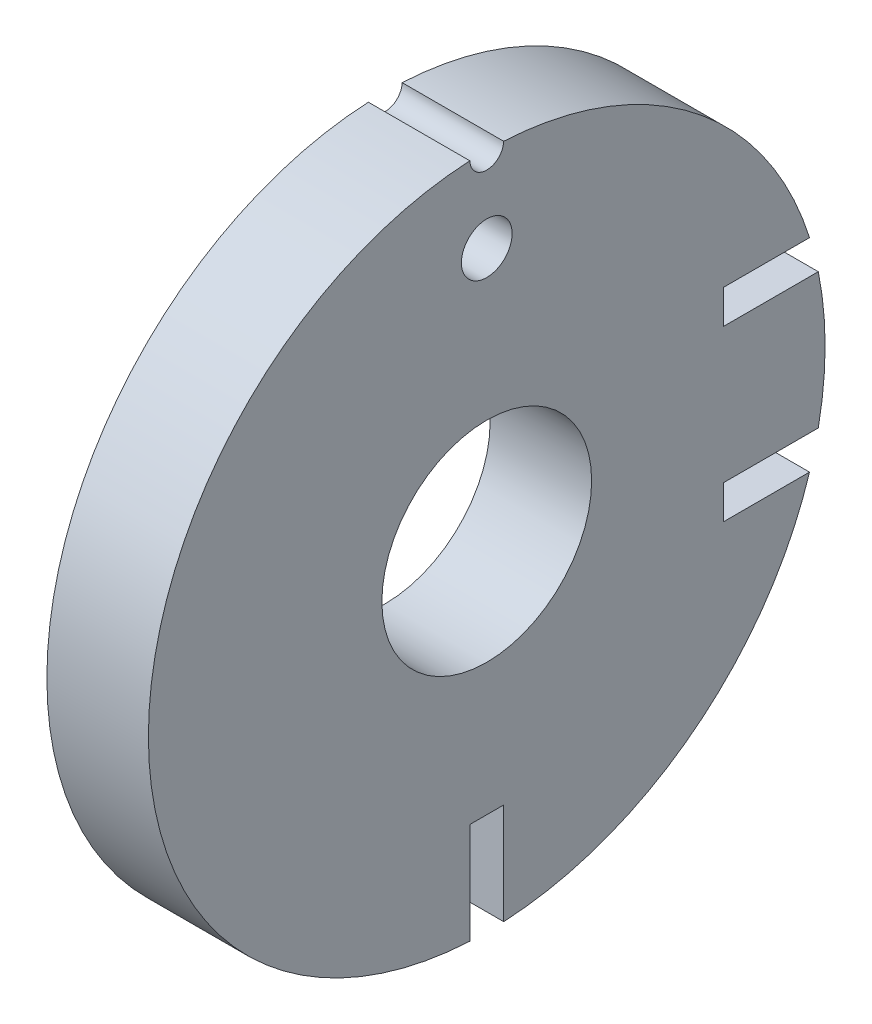
ISO-10303-21;
HEADER;
FILE_DESCRIPTION(('STEP AP214'),'2;1');
FILE_NAME('part.step','',(''),(''),'','','');
FILE_SCHEMA(('AUTOMOTIVE_DESIGN { 1 0 10303 214 1 1 1 1 }'));
ENDSEC;
DATA;
#1=APPLICATION_CONTEXT('core data for automotive mechanical design processes');
#2=APPLICATION_PROTOCOL_DEFINITION('international standard','automotive_design',2000,#1);
#3=PRODUCT_CONTEXT('',#1,'mechanical');
#4=PRODUCT('Part','Part','',(#3));
#5=PRODUCT_RELATED_PRODUCT_CATEGORY('part','',(#4));
#6=PRODUCT_DEFINITION_FORMATION('','',#4);
#7=PRODUCT_DEFINITION_CONTEXT('part definition',#1,'design');
#8=PRODUCT_DEFINITION('design','',#6,#7);
#9=PRODUCT_DEFINITION_SHAPE('','',#8);
#10=(LENGTH_UNIT() NAMED_UNIT(*) SI_UNIT(.MILLI.,.METRE.));
#11=(NAMED_UNIT(*) PLANE_ANGLE_UNIT() SI_UNIT($,.RADIAN.));
#12=(NAMED_UNIT(*) SI_UNIT($,.STERADIAN.) SOLID_ANGLE_UNIT());
#13=UNCERTAINTY_MEASURE_WITH_UNIT(LENGTH_MEASURE(1.E-05),#10,'distance_accuracy_value','');
#14=(GEOMETRIC_REPRESENTATION_CONTEXT(3) GLOBAL_UNCERTAINTY_ASSIGNED_CONTEXT((#13)) GLOBAL_UNIT_ASSIGNED_CONTEXT((#10,
#11,#12)) REPRESENTATION_CONTEXT('',''));
#15=CARTESIAN_POINT('',(0.,0.,0.));
#16=DIRECTION('',(0.,0.,1.));
#17=DIRECTION('',(1.,0.,0.));
#18=AXIS2_PLACEMENT_3D('',#15,#16,#17);
#19=CARTESIAN_POINT('',(3.,0.,0.));
#20=DIRECTION('',(-1.,0.,0.));
#21=DIRECTION('',(0.,0.,1.));
#22=AXIS2_PLACEMENT_3D('',#19,#20,#21);
#23=CYLINDRICAL_SURFACE('',#22,10.);
#24=CARTESIAN_POINT('',(0.,0.,0.));
#25=DIRECTION('',(1.,0.,0.));
#26=DIRECTION('',(0.,0.,-1.));
#27=AXIS2_PLACEMENT_3D('',#24,#25,#26);
#28=CIRCLE('',#27,10.);
#29=CARTESIAN_POINT('',(0.,9.9875,0.499843725578305));
#30=VERTEX_POINT('',#29);
#31=CARTESIAN_POINT('',(0.,-9.98749217771909,0.499999999999999));
#32=VERTEX_POINT('',#31);
#33=EDGE_CURVE('E262',#30,#32,#28,.T.);
#34=ORIENTED_EDGE('',*,*,#33,.T.);
#35=DIRECTION('',(-1.,0.,0.));
#36=VECTOR('',#35,1.);
#37=CARTESIAN_POINT('',(3.,-9.98749217771909,0.499999999999999));
#38=LINE('',#37,#36);
#39=CARTESIAN_POINT('',(3.,-9.98749217771909,0.499999999999999));
#40=VERTEX_POINT('',#39);
#41=EDGE_CURVE('E11',#32,#40,#38,.F.);
#42=ORIENTED_EDGE('',*,*,#41,.T.);
#43=CARTESIAN_POINT('',(3.,0.,0.));
#44=DIRECTION('',(1.,0.,0.));
#45=DIRECTION('',(0.,0.,-1.));
#46=AXIS2_PLACEMENT_3D('',#43,#44,#45);
#47=CIRCLE('',#46,10.);
#48=CARTESIAN_POINT('',(3.,9.9875,0.499843725578305));
#49=VERTEX_POINT('',#48);
#50=EDGE_CURVE('E276',#49,#40,#47,.T.);
#51=ORIENTED_EDGE('',*,*,#50,.F.);
#52=DIRECTION('',(1.,0.,0.));
#53=VECTOR('',#52,1.);
#54=CARTESIAN_POINT('',(1.5,9.9875,0.499843725578305));
#55=LINE('',#54,#53);
#56=EDGE_CURVE('E238',#49,#30,#55,.F.);
#57=ORIENTED_EDGE('',*,*,#56,.T.);
#58=EDGE_LOOP('',(#34,#42,#51,#57));
#59=FACE_BOUND('',#58,.T.);
#60=ADVANCED_FACE('F39',(#59),#23,.T.);
#61=CARTESIAN_POINT('',(3.,-2.,-9.79795897113271));
#62=VERTEX_POINT('',#61);
#63=CARTESIAN_POINT('',(3.,2.,-9.79795897113271));
#64=VERTEX_POINT('',#63);
#65=EDGE_CURVE('E230',#62,#64,#47,.T.);
#66=ORIENTED_EDGE('',*,*,#65,.F.);
#67=DIRECTION('',(-1.,0.,0.));
#68=VECTOR('',#67,1.);
#69=CARTESIAN_POINT('',(3.,-2.,-9.79795897113271));
#70=LINE('',#69,#68);
#71=CARTESIAN_POINT('',(0.,-2.,-9.79795897113271));
#72=VERTEX_POINT('',#71);
#73=EDGE_CURVE('E250',#62,#72,#70,.T.);
#74=ORIENTED_EDGE('',*,*,#73,.T.);
#75=CARTESIAN_POINT('',(0.,2.,-9.79795897113271));
#76=VERTEX_POINT('',#75);
#77=EDGE_CURVE('E227',#72,#76,#28,.T.);
#78=ORIENTED_EDGE('',*,*,#77,.T.);
#79=DIRECTION('',(-1.,0.,0.));
#80=VECTOR('',#79,1.);
#81=CARTESIAN_POINT('',(3.,2.,-9.79795897113271));
#82=LINE('',#81,#80);
#83=EDGE_CURVE('E243',#76,#64,#82,.F.);
#84=ORIENTED_EDGE('',*,*,#83,.T.);
#85=EDGE_LOOP('',(#66,#74,#78,#84));
#86=FACE_BOUND('',#85,.T.);
#87=ADVANCED_FACE('F295',(#86),#23,.T.);
#88=CARTESIAN_POINT('',(3.,3.,-9.53939201416945));
#89=VERTEX_POINT('',#88);
#90=CARTESIAN_POINT('',(3.,9.9875,-0.499843725578305));
#91=VERTEX_POINT('',#90);
#92=EDGE_CURVE('E234',#89,#91,#47,.T.);
#93=ORIENTED_EDGE('',*,*,#92,.F.);
#94=DIRECTION('',(-1.,0.,0.));
#95=VECTOR('',#94,1.);
#96=CARTESIAN_POINT('',(3.,3.,-9.53939201416946));
#97=LINE('',#96,#95);
#98=CARTESIAN_POINT('',(0.,3.,-9.53939201416945));
#99=VERTEX_POINT('',#98);
#100=EDGE_CURVE('E145',#89,#99,#97,.T.);
#101=ORIENTED_EDGE('',*,*,#100,.T.);
#102=CARTESIAN_POINT('',(0.,9.9875,-0.499843725578305));
#103=VERTEX_POINT('',#102);
#104=EDGE_CURVE('E233',#99,#103,#28,.T.);
#105=ORIENTED_EDGE('',*,*,#104,.T.);
#106=DIRECTION('',(1.,0.,0.));
#107=VECTOR('',#106,1.);
#108=CARTESIAN_POINT('',(1.5,9.9875,-0.499843725578305));
#109=LINE('',#108,#107);
#110=EDGE_CURVE('E240',#103,#91,#109,.T.);
#111=ORIENTED_EDGE('',*,*,#110,.T.);
#112=EDGE_LOOP('',(#93,#101,#105,#111));
#113=FACE_BOUND('',#112,.T.);
#114=ADVANCED_FACE('F269',(#113),#23,.T.);
#115=CARTESIAN_POINT('',(3.,0.,0.));
#116=DIRECTION('',(1.,0.,0.));
#117=DIRECTION('',(0.,0.,-1.));
#118=AXIS2_PLACEMENT_3D('',#115,#116,#117);
#119=PLANE('',#118);
#120=DIRECTION('',(0.,-1.,0.));
#121=VECTOR('',#120,1.);
#122=CARTESIAN_POINT('',(3.,-7.,0.499999999999999));
#123=LINE('',#122,#121);
#124=CARTESIAN_POINT('',(3.,-7.,0.499999999999999));
#125=VERTEX_POINT('',#124);
#126=EDGE_CURVE('E184',#125,#40,#123,.T.);
#127=ORIENTED_EDGE('',*,*,#126,.F.);
#128=DIRECTION('',(0.,0.,1.));
#129=VECTOR('',#128,1.);
#130=CARTESIAN_POINT('',(3.,-7.,0.499999999999999));
#131=LINE('',#130,#129);
#132=CARTESIAN_POINT('',(3.,-7.,-0.500000000000001));
#133=VERTEX_POINT('',#132);
#134=EDGE_CURVE('E205',#133,#125,#131,.T.);
#135=ORIENTED_EDGE('',*,*,#134,.F.);
#136=DIRECTION('',(0.,1.,0.));
#137=VECTOR('',#136,1.);
#138=CARTESIAN_POINT('',(3.,-7.,-0.500000000000001));
#139=LINE('',#138,#137);
#140=CARTESIAN_POINT('',(3.,-9.98749217771909,-0.500000000000001));
#141=VERTEX_POINT('',#140);
#142=EDGE_CURVE('E208',#141,#133,#139,.T.);
#143=ORIENTED_EDGE('',*,*,#142,.F.);
#144=CARTESIAN_POINT('',(3.,-3.,-9.53939201416946));
#145=VERTEX_POINT('',#144);
#146=EDGE_CURVE('E232',#141,#145,#47,.T.);
#147=ORIENTED_EDGE('',*,*,#146,.T.);
#148=DIRECTION('',(0.,0.,-1.));
#149=VECTOR('',#148,1.);
#150=CARTESIAN_POINT('',(3.,-3.,-7.));
#151=LINE('',#150,#149);
#152=CARTESIAN_POINT('',(3.,-3.,-7.));
#153=VERTEX_POINT('',#152);
#154=EDGE_CURVE('E187',#153,#145,#151,.T.);
#155=ORIENTED_EDGE('',*,*,#154,.F.);
#156=DIRECTION('',(0.,-1.,0.));
#157=VECTOR('',#156,1.);
#158=CARTESIAN_POINT('',(3.,-2.,-7.));
#159=LINE('',#158,#157);
#160=CARTESIAN_POINT('',(3.,-2.,-7.));
#161=VERTEX_POINT('',#160);
#162=EDGE_CURVE('E161',#161,#153,#159,.T.);
#163=ORIENTED_EDGE('',*,*,#162,.F.);
#164=DIRECTION('',(0.,0.,1.));
#165=VECTOR('',#164,1.);
#166=CARTESIAN_POINT('',(3.,-2.,-7.));
#167=LINE('',#166,#165);
#168=EDGE_CURVE('E185',#62,#161,#167,.T.);
#169=ORIENTED_EDGE('',*,*,#168,.F.);
#170=ORIENTED_EDGE('',*,*,#65,.T.);
#171=DIRECTION('',(0.,0.,-1.));
#172=VECTOR('',#171,1.);
#173=CARTESIAN_POINT('',(3.,2.,-7.));
#174=LINE('',#173,#172);
#175=CARTESIAN_POINT('',(3.,2.,-7.));
#176=VERTEX_POINT('',#175);
#177=EDGE_CURVE('E150',#176,#64,#174,.T.);
#178=ORIENTED_EDGE('',*,*,#177,.F.);
#179=DIRECTION('',(0.,-1.,0.));
#180=VECTOR('',#179,1.);
#181=CARTESIAN_POINT('',(3.,3.,-7.));
#182=LINE('',#181,#180);
#183=CARTESIAN_POINT('',(3.,3.,-7.));
#184=VERTEX_POINT('',#183);
#185=EDGE_CURVE('E156',#184,#176,#182,.T.);
#186=ORIENTED_EDGE('',*,*,#185,.F.);
#187=DIRECTION('',(0.,0.,1.));
#188=VECTOR('',#187,1.);
#189=CARTESIAN_POINT('',(3.,3.,-7.));
#190=LINE('',#189,#188);
#191=EDGE_CURVE('E139',#89,#184,#190,.T.);
#192=ORIENTED_EDGE('',*,*,#191,.F.);
#193=ORIENTED_EDGE('',*,*,#92,.T.);
#194=CARTESIAN_POINT('',(3.,10.,0.));
#195=DIRECTION('',(1.,0.,0.));
#196=DIRECTION('',(0.,0.,-1.));
#197=AXIS2_PLACEMENT_3D('',#194,#195,#196);
#198=CIRCLE('',#197,0.5);
#199=EDGE_CURVE('E168',#49,#91,#198,.T.);
#200=ORIENTED_EDGE('',*,*,#199,.F.);
#201=ORIENTED_EDGE('',*,*,#50,.T.);
#202=EDGE_LOOP('',(#127,#135,#143,#147,#155,#163,#169,#170,#178,#186,#192,#193,#200,#201));
#203=FACE_BOUND('',#202,.T.);
#204=CARTESIAN_POINT('',(3.,7.5,0.));
#205=DIRECTION('',(1.,0.,0.));
#206=DIRECTION('',(0.,0.,-1.));
#207=AXIS2_PLACEMENT_3D('',#204,#205,#206);
#208=CIRCLE('',#207,0.75);
#209=CARTESIAN_POINT('',(3.,7.5,-0.75));
#210=VERTEX_POINT('',#209);
#211=EDGE_CURVE('E221',#210,#210,#208,.T.);
#212=ORIENTED_EDGE('',*,*,#211,.F.);
#213=EDGE_LOOP('',(#212));
#214=FACE_BOUND('',#213,.T.);
#215=CARTESIAN_POINT('',(3.,0.,0.));
#216=DIRECTION('',(1.,0.,0.));
#217=DIRECTION('',(0.,0.,-1.));
#218=AXIS2_PLACEMENT_3D('',#215,#216,#217);
#219=CIRCLE('',#218,3.1);
#220=CARTESIAN_POINT('',(3.,0.,-3.1));
#221=VERTEX_POINT('',#220);
#222=EDGE_CURVE('E224',#221,#221,#219,.T.);
#223=ORIENTED_EDGE('',*,*,#222,.F.);
#224=EDGE_LOOP('',(#223));
#225=FACE_BOUND('',#224,.T.);
#226=ADVANCED_FACE('F164',(#203,#214,#225),#119,.T.);
#227=CARTESIAN_POINT('',(0.,0.,0.));
#228=DIRECTION('',(1.,0.,0.));
#229=DIRECTION('',(0.,0.,-1.));
#230=AXIS2_PLACEMENT_3D('',#227,#228,#229);
#231=PLANE('',#230);
#232=CARTESIAN_POINT('',(0.,7.5,0.));
#233=DIRECTION('',(1.,0.,0.));
#234=DIRECTION('',(0.,0.,-1.));
#235=AXIS2_PLACEMENT_3D('',#232,#233,#234);
#236=CIRCLE('',#235,0.75);
#237=CARTESIAN_POINT('',(0.,7.5,-0.75));
#238=VERTEX_POINT('',#237);
#239=EDGE_CURVE('E217',#238,#238,#236,.T.);
#240=ORIENTED_EDGE('',*,*,#239,.T.);
#241=EDGE_LOOP('',(#240));
#242=FACE_BOUND('',#241,.T.);
#243=DIRECTION('',(0.,0.,1.));
#244=VECTOR('',#243,1.);
#245=CARTESIAN_POINT('',(0.,-7.,0.499999999999999));
#246=LINE('',#245,#244);
#247=CARTESIAN_POINT('',(0.,-7.,-0.500000000000001));
#248=VERTEX_POINT('',#247);
#249=CARTESIAN_POINT('',(0.,-7.,0.499999999999999));
#250=VERTEX_POINT('',#249);
#251=EDGE_CURVE('E202',#248,#250,#246,.T.);
#252=ORIENTED_EDGE('',*,*,#251,.T.);
#253=DIRECTION('',(0.,-1.,0.));
#254=VECTOR('',#253,1.);
#255=CARTESIAN_POINT('',(0.,-7.,0.499999999999999));
#256=LINE('',#255,#254);
#257=EDGE_CURVE('E209',#250,#32,#256,.T.);
#258=ORIENTED_EDGE('',*,*,#257,.T.);
#259=ORIENTED_EDGE('',*,*,#33,.F.);
#260=CARTESIAN_POINT('',(0.,10.,0.));
#261=DIRECTION('',(1.,0.,0.));
#262=DIRECTION('',(0.,0.,-1.));
#263=AXIS2_PLACEMENT_3D('',#260,#261,#262);
#264=CIRCLE('',#263,0.5);
#265=EDGE_CURVE('E62',#30,#103,#264,.T.);
#266=ORIENTED_EDGE('',*,*,#265,.T.);
#267=ORIENTED_EDGE('',*,*,#104,.F.);
#268=DIRECTION('',(0.,0.,1.));
#269=VECTOR('',#268,1.);
#270=CARTESIAN_POINT('',(0.,3.,-7.));
#271=LINE('',#270,#269);
#272=CARTESIAN_POINT('',(0.,3.,-7.));
#273=VERTEX_POINT('',#272);
#274=EDGE_CURVE('E172',#99,#273,#271,.T.);
#275=ORIENTED_EDGE('',*,*,#274,.T.);
#276=DIRECTION('',(0.,-1.,0.));
#277=VECTOR('',#276,1.);
#278=CARTESIAN_POINT('',(0.,3.,-7.));
#279=LINE('',#278,#277);
#280=CARTESIAN_POINT('',(0.,2.,-7.));
#281=VERTEX_POINT('',#280);
#282=EDGE_CURVE('E151',#273,#281,#279,.T.);
#283=ORIENTED_EDGE('',*,*,#282,.T.);
#284=DIRECTION('',(0.,0.,-1.));
#285=VECTOR('',#284,1.);
#286=CARTESIAN_POINT('',(0.,2.,-7.));
#287=LINE('',#286,#285);
#288=EDGE_CURVE('E174',#281,#76,#287,.T.);
#289=ORIENTED_EDGE('',*,*,#288,.T.);
#290=ORIENTED_EDGE('',*,*,#77,.F.);
#291=DIRECTION('',(0.,0.,1.));
#292=VECTOR('',#291,1.);
#293=CARTESIAN_POINT('',(0.,-2.,-7.));
#294=LINE('',#293,#292);
#295=CARTESIAN_POINT('',(0.,-2.,-7.));
#296=VERTEX_POINT('',#295);
#297=EDGE_CURVE('E180',#72,#296,#294,.T.);
#298=ORIENTED_EDGE('',*,*,#297,.T.);
#299=DIRECTION('',(0.,-1.,0.));
#300=VECTOR('',#299,1.);
#301=CARTESIAN_POINT('',(0.,-2.,-7.));
#302=LINE('',#301,#300);
#303=CARTESIAN_POINT('',(0.,-3.,-7.));
#304=VERTEX_POINT('',#303);
#305=EDGE_CURVE('E188',#296,#304,#302,.T.);
#306=ORIENTED_EDGE('',*,*,#305,.T.);
#307=DIRECTION('',(0.,0.,-1.));
#308=VECTOR('',#307,1.);
#309=CARTESIAN_POINT('',(0.,-3.,-7.));
#310=LINE('',#309,#308);
#311=CARTESIAN_POINT('',(0.,-3.,-9.53939201416945));
#312=VERTEX_POINT('',#311);
#313=EDGE_CURVE('E194',#304,#312,#310,.T.);
#314=ORIENTED_EDGE('',*,*,#313,.T.);
#315=CARTESIAN_POINT('',(0.,-9.98749217771909,-0.500000000000001));
#316=VERTEX_POINT('',#315);
#317=EDGE_CURVE('E237',#316,#312,#28,.T.);
#318=ORIENTED_EDGE('',*,*,#317,.F.);
#319=DIRECTION('',(0.,1.,0.));
#320=VECTOR('',#319,1.);
#321=CARTESIAN_POINT('',(0.,-7.,-0.500000000000001));
#322=LINE('',#321,#320);
#323=EDGE_CURVE('E54',#316,#248,#322,.T.);
#324=ORIENTED_EDGE('',*,*,#323,.T.);
#325=EDGE_LOOP('',(#252,#258,#259,#266,#267,#275,#283,#289,#290,#298,#306,#314,#318,#324));
#326=FACE_BOUND('',#325,.T.);
#327=CARTESIAN_POINT('',(0.,0.,0.));
#328=DIRECTION('',(1.,0.,0.));
#329=DIRECTION('',(0.,0.,-1.));
#330=AXIS2_PLACEMENT_3D('',#327,#328,#329);
#331=CIRCLE('',#330,3.1);
#332=CARTESIAN_POINT('',(0.,0.,-3.1));
#333=VERTEX_POINT('',#332);
#334=EDGE_CURVE('E220',#333,#333,#331,.T.);
#335=ORIENTED_EDGE('',*,*,#334,.T.);
#336=EDGE_LOOP('',(#335));
#337=FACE_BOUND('',#336,.T.);
#338=ADVANCED_FACE('F259',(#242,#326,#337),#231,.F.);
#339=ORIENTED_EDGE('',*,*,#146,.F.);
#340=DIRECTION('',(-1.,0.,0.));
#341=VECTOR('',#340,1.);
#342=CARTESIAN_POINT('',(3.,-9.98749217771909,-0.500000000000001));
#343=LINE('',#342,#341);
#344=EDGE_CURVE('E47',#141,#316,#343,.T.);
#345=ORIENTED_EDGE('',*,*,#344,.T.);
#346=ORIENTED_EDGE('',*,*,#317,.T.);
#347=DIRECTION('',(-1.,0.,0.));
#348=VECTOR('',#347,1.);
#349=CARTESIAN_POINT('',(3.,-3.,-9.53939201416946));
#350=LINE('',#349,#348);
#351=EDGE_CURVE('E247',#312,#145,#350,.F.);
#352=ORIENTED_EDGE('',*,*,#351,.T.);
#353=EDGE_LOOP('',(#339,#345,#346,#352));
#354=FACE_BOUND('',#353,.T.);
#355=ADVANCED_FACE('F41',(#354),#23,.T.);
#356=CARTESIAN_POINT('',(3.,0.,0.));
#357=DIRECTION('',(-1.,0.,0.));
#358=DIRECTION('',(0.,0.,1.));
#359=AXIS2_PLACEMENT_3D('',#356,#357,#358);
#360=CYLINDRICAL_SURFACE('',#359,3.1);
#361=ORIENTED_EDGE('',*,*,#222,.T.);
#362=EDGE_LOOP('',(#361));
#363=FACE_BOUND('',#362,.T.);
#364=ORIENTED_EDGE('',*,*,#334,.F.);
#365=EDGE_LOOP('',(#364));
#366=FACE_BOUND('',#365,.T.);
#367=ADVANCED_FACE('F302',(#363,#366),#360,.F.);
#368=CARTESIAN_POINT('',(0.,10.,0.));
#369=DIRECTION('',(1.,0.,0.));
#370=DIRECTION('',(0.,0.,-1.));
#371=AXIS2_PLACEMENT_3D('',#368,#369,#370);
#372=CYLINDRICAL_SURFACE('',#371,0.5);
#373=ORIENTED_EDGE('',*,*,#265,.F.);
#374=ORIENTED_EDGE('',*,*,#56,.F.);
#375=ORIENTED_EDGE('',*,*,#199,.T.);
#376=ORIENTED_EDGE('',*,*,#110,.F.);
#377=EDGE_LOOP('',(#373,#374,#375,#376));
#378=FACE_BOUND('',#377,.T.);
#379=ADVANCED_FACE('F307',(#378),#372,.F.);
#380=CARTESIAN_POINT('',(0.,3.,-7.));
#381=DIRECTION('',(0.,1.,0.));
#382=DIRECTION('',(0.,0.,1.));
#383=AXIS2_PLACEMENT_3D('',#380,#381,#382);
#384=PLANE('',#383);
#385=ORIENTED_EDGE('',*,*,#191,.T.);
#386=DIRECTION('',(1.,0.,0.));
#387=VECTOR('',#386,1.);
#388=CARTESIAN_POINT('',(0.,3.,-7.));
#389=LINE('',#388,#387);
#390=EDGE_CURVE('E142',#273,#184,#389,.T.);
#391=ORIENTED_EDGE('',*,*,#390,.F.);
#392=ORIENTED_EDGE('',*,*,#274,.F.);
#393=ORIENTED_EDGE('',*,*,#100,.F.);
#394=EDGE_LOOP('',(#385,#391,#392,#393));
#395=FACE_BOUND('',#394,.T.);
#396=ADVANCED_FACE('F141',(#395),#384,.F.);
#397=CARTESIAN_POINT('',(0.,2.,-7.));
#398=DIRECTION('',(0.,-1.,0.));
#399=DIRECTION('',(0.,0.,-1.));
#400=AXIS2_PLACEMENT_3D('',#397,#398,#399);
#401=PLANE('',#400);
#402=ORIENTED_EDGE('',*,*,#288,.F.);
#403=DIRECTION('',(1.,0.,0.));
#404=VECTOR('',#403,1.);
#405=CARTESIAN_POINT('',(0.,2.,-7.));
#406=LINE('',#405,#404);
#407=EDGE_CURVE('E160',#281,#176,#406,.T.);
#408=ORIENTED_EDGE('',*,*,#407,.T.);
#409=ORIENTED_EDGE('',*,*,#177,.T.);
#410=ORIENTED_EDGE('',*,*,#83,.F.);
#411=EDGE_LOOP('',(#402,#408,#409,#410));
#412=FACE_BOUND('',#411,.T.);
#413=ADVANCED_FACE('F363',(#412),#401,.F.);
#414=CARTESIAN_POINT('',(0.,3.,-7.));
#415=DIRECTION('',(0.,0.,1.));
#416=DIRECTION('',(1.,0.,0.));
#417=AXIS2_PLACEMENT_3D('',#414,#415,#416);
#418=PLANE('',#417);
#419=ORIENTED_EDGE('',*,*,#185,.T.);
#420=ORIENTED_EDGE('',*,*,#407,.F.);
#421=ORIENTED_EDGE('',*,*,#282,.F.);
#422=ORIENTED_EDGE('',*,*,#390,.T.);
#423=EDGE_LOOP('',(#419,#420,#421,#422));
#424=FACE_BOUND('',#423,.T.);
#425=ADVANCED_FACE('F155',(#424),#418,.F.);
#426=CARTESIAN_POINT('',(0.,-2.,-7.));
#427=DIRECTION('',(0.,1.,0.));
#428=DIRECTION('',(0.,0.,1.));
#429=AXIS2_PLACEMENT_3D('',#426,#427,#428);
#430=PLANE('',#429);
#431=ORIENTED_EDGE('',*,*,#168,.T.);
#432=DIRECTION('',(1.,0.,0.));
#433=VECTOR('',#432,1.);
#434=CARTESIAN_POINT('',(0.,-2.,-7.));
#435=LINE('',#434,#433);
#436=EDGE_CURVE('E181',#296,#161,#435,.T.);
#437=ORIENTED_EDGE('',*,*,#436,.F.);
#438=ORIENTED_EDGE('',*,*,#297,.F.);
#439=ORIENTED_EDGE('',*,*,#73,.F.);
#440=EDGE_LOOP('',(#431,#437,#438,#439));
#441=FACE_BOUND('',#440,.T.);
#442=ADVANCED_FACE('F381',(#441),#430,.F.);
#443=CARTESIAN_POINT('',(0.,-3.,-7.));
#444=DIRECTION('',(0.,-1.,0.));
#445=DIRECTION('',(0.,0.,-1.));
#446=AXIS2_PLACEMENT_3D('',#443,#444,#445);
#447=PLANE('',#446);
#448=ORIENTED_EDGE('',*,*,#313,.F.);
#449=DIRECTION('',(1.,0.,0.));
#450=VECTOR('',#449,1.);
#451=CARTESIAN_POINT('',(0.,-3.,-7.));
#452=LINE('',#451,#450);
#453=EDGE_CURVE('E178',#304,#153,#452,.T.);
#454=ORIENTED_EDGE('',*,*,#453,.T.);
#455=ORIENTED_EDGE('',*,*,#154,.T.);
#456=ORIENTED_EDGE('',*,*,#351,.F.);
#457=EDGE_LOOP('',(#448,#454,#455,#456));
#458=FACE_BOUND('',#457,.T.);
#459=ADVANCED_FACE('F390',(#458),#447,.F.);
#460=CARTESIAN_POINT('',(0.,-2.,-7.));
#461=DIRECTION('',(0.,0.,1.));
#462=DIRECTION('',(1.,0.,0.));
#463=AXIS2_PLACEMENT_3D('',#460,#461,#462);
#464=PLANE('',#463);
#465=ORIENTED_EDGE('',*,*,#162,.T.);
#466=ORIENTED_EDGE('',*,*,#453,.F.);
#467=ORIENTED_EDGE('',*,*,#305,.F.);
#468=ORIENTED_EDGE('',*,*,#436,.T.);
#469=EDGE_LOOP('',(#465,#466,#467,#468));
#470=FACE_BOUND('',#469,.T.);
#471=ADVANCED_FACE('F400',(#470),#464,.F.);
#472=CARTESIAN_POINT('',(0.,-7.,0.499999999999999));
#473=DIRECTION('',(0.,0.,1.));
#474=DIRECTION('',(0.,-1.,0.));
#475=AXIS2_PLACEMENT_3D('',#472,#473,#474);
#476=PLANE('',#475);
#477=ORIENTED_EDGE('',*,*,#257,.F.);
#478=DIRECTION('',(1.,0.,0.));
#479=VECTOR('',#478,1.);
#480=CARTESIAN_POINT('',(0.,-7.,0.499999999999999));
#481=LINE('',#480,#479);
#482=EDGE_CURVE('E203',#250,#125,#481,.T.);
#483=ORIENTED_EDGE('',*,*,#482,.T.);
#484=ORIENTED_EDGE('',*,*,#126,.T.);
#485=ORIENTED_EDGE('',*,*,#41,.F.);
#486=EDGE_LOOP('',(#477,#483,#484,#485));
#487=FACE_BOUND('',#486,.T.);
#488=ADVANCED_FACE('F273',(#487),#476,.F.);
#489=CARTESIAN_POINT('',(0.,-7.,-0.500000000000001));
#490=DIRECTION('',(0.,0.,-1.));
#491=DIRECTION('',(0.,1.,0.));
#492=AXIS2_PLACEMENT_3D('',#489,#490,#491);
#493=PLANE('',#492);
#494=ORIENTED_EDGE('',*,*,#142,.T.);
#495=DIRECTION('',(1.,0.,0.));
#496=VECTOR('',#495,1.);
#497=CARTESIAN_POINT('',(0.,-7.,-0.500000000000001));
#498=LINE('',#497,#496);
#499=EDGE_CURVE('E199',#248,#133,#498,.T.);
#500=ORIENTED_EDGE('',*,*,#499,.F.);
#501=ORIENTED_EDGE('',*,*,#323,.F.);
#502=ORIENTED_EDGE('',*,*,#344,.F.);
#503=EDGE_LOOP('',(#494,#500,#501,#502));
#504=FACE_BOUND('',#503,.T.);
#505=ADVANCED_FACE('F281',(#504),#493,.F.);
#506=CARTESIAN_POINT('',(0.,-7.,0.499999999999999));
#507=DIRECTION('',(0.,1.,0.));
#508=DIRECTION('',(0.,0.,1.));
#509=AXIS2_PLACEMENT_3D('',#506,#507,#508);
#510=PLANE('',#509);
#511=ORIENTED_EDGE('',*,*,#134,.T.);
#512=ORIENTED_EDGE('',*,*,#482,.F.);
#513=ORIENTED_EDGE('',*,*,#251,.F.);
#514=ORIENTED_EDGE('',*,*,#499,.T.);
#515=EDGE_LOOP('',(#511,#512,#513,#514));
#516=FACE_BOUND('',#515,.T.);
#517=ADVANCED_FACE('F283',(#516),#510,.F.);
#518=CARTESIAN_POINT('',(0.,7.5,0.));
#519=DIRECTION('',(1.,0.,0.));
#520=DIRECTION('',(0.,0.,-1.));
#521=AXIS2_PLACEMENT_3D('',#518,#519,#520);
#522=CYLINDRICAL_SURFACE('',#521,0.75);
#523=ORIENTED_EDGE('',*,*,#239,.F.);
#524=EDGE_LOOP('',(#523));
#525=FACE_BOUND('',#524,.T.);
#526=ORIENTED_EDGE('',*,*,#211,.T.);
#527=EDGE_LOOP('',(#526));
#528=FACE_BOUND('',#527,.T.);
#529=ADVANCED_FACE('F285',(#525,#528),#522,.F.);
#530=CLOSED_SHELL('',(#60,#87,#114,#226,#338,#355,#367,#379,#396,#413,#425,#442,#459,#471,#488,
#505,#517,#529));
#531=MANIFOLD_SOLID_BREP('B2',#530);
#532=ADVANCED_BREP_SHAPE_REPRESENTATION('',(#18,#531),#14);
#533=SHAPE_DEFINITION_REPRESENTATION(#9,#532);
ENDSEC;
END-ISO-10303-21;
